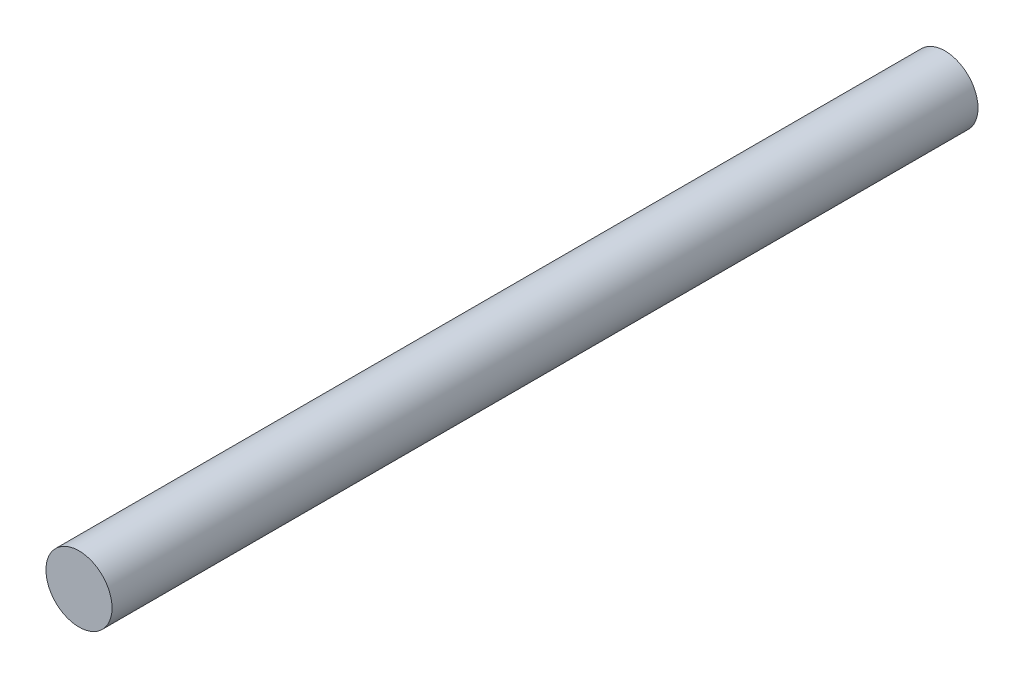
ISO-10303-21;
HEADER;
FILE_DESCRIPTION(('STEP AP214'),'2;1');
FILE_NAME('part.step','',(''),(''),'','','');
FILE_SCHEMA(('AUTOMOTIVE_DESIGN { 1 0 10303 214 1 1 1 1 }'));
ENDSEC;
DATA;
#1=APPLICATION_CONTEXT('core data for automotive mechanical design processes');
#2=APPLICATION_PROTOCOL_DEFINITION('international standard','automotive_design',2000,#1);
#3=PRODUCT_CONTEXT('',#1,'mechanical');
#4=PRODUCT('Part','Part','',(#3));
#5=PRODUCT_RELATED_PRODUCT_CATEGORY('part','',(#4));
#6=PRODUCT_DEFINITION_FORMATION('','',#4);
#7=PRODUCT_DEFINITION_CONTEXT('part definition',#1,'design');
#8=PRODUCT_DEFINITION('design','',#6,#7);
#9=PRODUCT_DEFINITION_SHAPE('','',#8);
#10=(LENGTH_UNIT() NAMED_UNIT(*) SI_UNIT(.MILLI.,.METRE.));
#11=(NAMED_UNIT(*) PLANE_ANGLE_UNIT() SI_UNIT($,.RADIAN.));
#12=(NAMED_UNIT(*) SI_UNIT($,.STERADIAN.) SOLID_ANGLE_UNIT());
#13=UNCERTAINTY_MEASURE_WITH_UNIT(LENGTH_MEASURE(1.E-05),#10,'distance_accuracy_value','');
#14=(GEOMETRIC_REPRESENTATION_CONTEXT(3) GLOBAL_UNCERTAINTY_ASSIGNED_CONTEXT((#13)) GLOBAL_UNIT_ASSIGNED_CONTEXT((#10,
#11,#12)) REPRESENTATION_CONTEXT('',''));
#15=CARTESIAN_POINT('',(0.,0.,0.));
#16=DIRECTION('',(0.,0.,1.));
#17=DIRECTION('',(1.,0.,0.));
#18=AXIS2_PLACEMENT_3D('',#15,#16,#17);
#19=CARTESIAN_POINT('',(0.,0.,26.2));
#20=DIRECTION('',(0.,0.,-1.));
#21=DIRECTION('',(-1.,0.,0.));
#22=AXIS2_PLACEMENT_3D('',#19,#20,#21);
#23=CYLINDRICAL_SURFACE('',#22,1.);
#24=CARTESIAN_POINT('',(0.,0.,26.2));
#25=DIRECTION('',(0.,0.,1.));
#26=DIRECTION('',(1.,0.,0.));
#27=AXIS2_PLACEMENT_3D('',#24,#25,#26);
#28=CIRCLE('',#27,1.);
#29=CARTESIAN_POINT('',(1.,0.,26.2));
#30=VERTEX_POINT('',#29);
#31=EDGE_CURVE('E10',#30,#30,#28,.T.);
#32=ORIENTED_EDGE('',*,*,#31,.F.);
#33=EDGE_LOOP('',(#32));
#34=FACE_BOUND('',#33,.T.);
#35=CARTESIAN_POINT('',(0.,0.,0.));
#36=DIRECTION('',(0.,0.,1.));
#37=DIRECTION('',(1.,0.,0.));
#38=AXIS2_PLACEMENT_3D('',#35,#36,#37);
#39=CIRCLE('',#38,1.);
#40=CARTESIAN_POINT('',(1.,0.,0.));
#41=VERTEX_POINT('',#40);
#42=EDGE_CURVE('E34',#41,#41,#39,.T.);
#43=ORIENTED_EDGE('',*,*,#42,.T.);
#44=EDGE_LOOP('',(#43));
#45=FACE_BOUND('',#44,.T.);
#46=ADVANCED_FACE('F31',(#34,#45),#23,.T.);
#47=CARTESIAN_POINT('',(0.,0.,26.2));
#48=DIRECTION('',(0.,0.,1.));
#49=DIRECTION('',(1.,0.,0.));
#50=AXIS2_PLACEMENT_3D('',#47,#48,#49);
#51=PLANE('',#50);
#52=ORIENTED_EDGE('',*,*,#31,.T.);
#53=EDGE_LOOP('',(#52));
#54=FACE_BOUND('',#53,.T.);
#55=ADVANCED_FACE('F46',(#54),#51,.T.);
#56=CARTESIAN_POINT('',(0.,0.,0.));
#57=DIRECTION('',(0.,0.,1.));
#58=DIRECTION('',(1.,0.,0.));
#59=AXIS2_PLACEMENT_3D('',#56,#57,#58);
#60=PLANE('',#59);
#61=ORIENTED_EDGE('',*,*,#42,.F.);
#62=EDGE_LOOP('',(#61));
#63=FACE_BOUND('',#62,.T.);
#64=ADVANCED_FACE('F44',(#63),#60,.F.);
#65=CLOSED_SHELL('',(#46,#55,#64));
#66=MANIFOLD_SOLID_BREP('B2',#65);
#67=ADVANCED_BREP_SHAPE_REPRESENTATION('',(#18,#66),#14);
#68=SHAPE_DEFINITION_REPRESENTATION(#9,#67);
ENDSEC;
END-ISO-10303-21;
